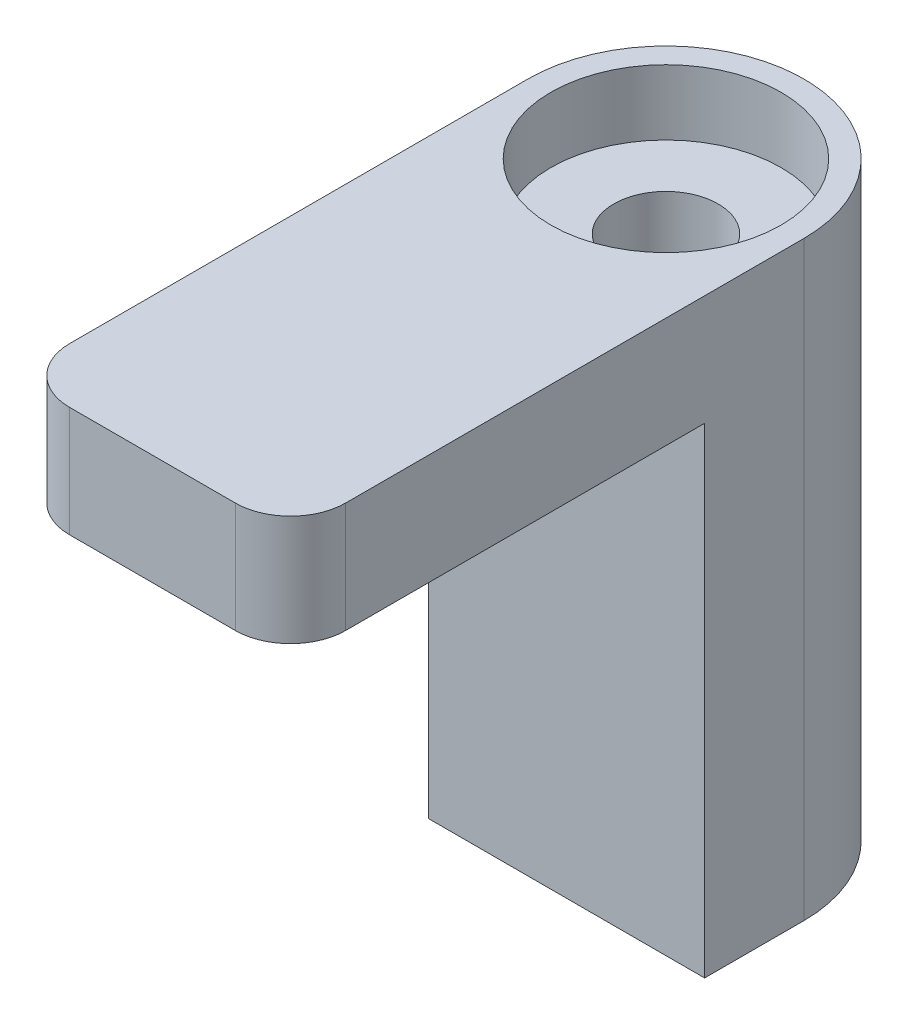
ISO-10303-21;
HEADER;
FILE_DESCRIPTION(('STEP AP214'),'2;1');
FILE_NAME('part.step','',(''),(''),'','','');
FILE_SCHEMA(('AUTOMOTIVE_DESIGN { 1 0 10303 214 1 1 1 1 }'));
ENDSEC;
DATA;
#1=APPLICATION_CONTEXT('core data for automotive mechanical design processes');
#2=APPLICATION_PROTOCOL_DEFINITION('international standard','automotive_design',2000,#1);
#3=PRODUCT_CONTEXT('',#1,'mechanical');
#4=PRODUCT('Part','Part','',(#3));
#5=PRODUCT_RELATED_PRODUCT_CATEGORY('part','',(#4));
#6=PRODUCT_DEFINITION_FORMATION('','',#4);
#7=PRODUCT_DEFINITION_CONTEXT('part definition',#1,'design');
#8=PRODUCT_DEFINITION('design','',#6,#7);
#9=PRODUCT_DEFINITION_SHAPE('','',#8);
#10=(LENGTH_UNIT() NAMED_UNIT(*) SI_UNIT(.MILLI.,.METRE.));
#11=(NAMED_UNIT(*) PLANE_ANGLE_UNIT() SI_UNIT($,.RADIAN.));
#12=(NAMED_UNIT(*) SI_UNIT($,.STERADIAN.) SOLID_ANGLE_UNIT());
#13=UNCERTAINTY_MEASURE_WITH_UNIT(LENGTH_MEASURE(1.E-05),#10,'distance_accuracy_value','');
#14=(GEOMETRIC_REPRESENTATION_CONTEXT(3) GLOBAL_UNCERTAINTY_ASSIGNED_CONTEXT((#13)) GLOBAL_UNIT_ASSIGNED_CONTEXT((#10,
#11,#12)) REPRESENTATION_CONTEXT('',''));
#15=CARTESIAN_POINT('',(0.,0.,0.));
#16=DIRECTION('',(0.,0.,1.));
#17=DIRECTION('',(1.,0.,0.));
#18=AXIS2_PLACEMENT_3D('',#15,#16,#17);
#19=CARTESIAN_POINT('',(6.35,22.098,-4.572));
#20=DIRECTION('',(-1.,0.,0.));
#21=DIRECTION('',(0.,0.,1.));
#22=AXIS2_PLACEMENT_3D('',#19,#20,#21);
#23=PLANE('',#22);
#24=DIRECTION('',(0.,0.,-1.));
#25=VECTOR('',#24,1.);
#26=CARTESIAN_POINT('',(6.35,27.178,0.));
#27=LINE('',#26,#25);
#28=CARTESIAN_POINT('',(6.35,27.178,16.51));
#29=VERTEX_POINT('',#28);
#30=CARTESIAN_POINT('',(6.35,27.178,-4.57200000000001));
#31=VERTEX_POINT('',#30);
#32=EDGE_CURVE('E103',#29,#31,#27,.T.);
#33=ORIENTED_EDGE('',*,*,#32,.F.);
#34=DIRECTION('',(0.,-1.,0.));
#35=VECTOR('',#34,1.);
#36=CARTESIAN_POINT('',(6.34999999999999,22.098,16.51));
#37=LINE('',#36,#35);
#38=CARTESIAN_POINT('',(6.34999999999999,22.098,16.51));
#39=VERTEX_POINT('',#38);
#40=EDGE_CURVE('E121',#29,#39,#37,.T.);
#41=ORIENTED_EDGE('',*,*,#40,.T.);
#42=DIRECTION('',(0.,0.,-1.));
#43=VECTOR('',#42,1.);
#44=CARTESIAN_POINT('',(6.35,22.098,0.));
#45=LINE('',#44,#43);
#46=CARTESIAN_POINT('',(6.35,22.098,0.));
#47=VERTEX_POINT('',#46);
#48=EDGE_CURVE('E133',#39,#47,#45,.T.);
#49=ORIENTED_EDGE('',*,*,#48,.T.);
#50=DIRECTION('',(0.,-1.,0.));
#51=VECTOR('',#50,1.);
#52=CARTESIAN_POINT('',(6.35,22.098,0.));
#53=LINE('',#52,#51);
#54=CARTESIAN_POINT('',(6.35,0.,0.));
#55=VERTEX_POINT('',#54);
#56=EDGE_CURVE('E142',#47,#55,#53,.T.);
#57=ORIENTED_EDGE('',*,*,#56,.T.);
#58=DIRECTION('',(0.,0.,-1.));
#59=VECTOR('',#58,1.);
#60=CARTESIAN_POINT('',(6.35,0.,-4.572));
#61=LINE('',#60,#59);
#62=CARTESIAN_POINT('',(6.35,0.,-4.572));
#63=VERTEX_POINT('',#62);
#64=EDGE_CURVE('E119',#55,#63,#61,.T.);
#65=ORIENTED_EDGE('',*,*,#64,.T.);
#66=DIRECTION('',(0.,-1.,0.));
#67=VECTOR('',#66,1.);
#68=CARTESIAN_POINT('',(6.35,22.098,-4.572));
#69=LINE('',#68,#67);
#70=EDGE_CURVE('E116',#31,#63,#69,.T.);
#71=ORIENTED_EDGE('',*,*,#70,.F.);
#72=EDGE_LOOP('',(#33,#41,#49,#57,#65,#71));
#73=FACE_BOUND('',#72,.T.);
#74=ADVANCED_FACE('F36',(#73),#23,.F.);
#75=CARTESIAN_POINT('',(0.,22.098,-4.572));
#76=DIRECTION('',(0.,-1.,0.));
#77=DIRECTION('',(0.,0.,-1.));
#78=AXIS2_PLACEMENT_3D('',#75,#76,#77);
#79=CYLINDRICAL_SURFACE('',#78,6.35);
#80=CARTESIAN_POINT('',(0.,0.,-4.572));
#81=DIRECTION('',(0.,1.,0.));
#82=DIRECTION('',(0.,0.,1.));
#83=AXIS2_PLACEMENT_3D('',#80,#81,#82);
#84=CIRCLE('',#83,6.35);
#85=CARTESIAN_POINT('',(-6.35,0.,-4.572));
#86=VERTEX_POINT('',#85);
#87=EDGE_CURVE('E145',#63,#86,#84,.T.);
#88=ORIENTED_EDGE('',*,*,#87,.T.);
#89=DIRECTION('',(0.,-1.,0.));
#90=VECTOR('',#89,1.);
#91=CARTESIAN_POINT('',(-6.35,22.098,-4.57199999999999));
#92=LINE('',#91,#90);
#93=CARTESIAN_POINT('',(-6.35,27.178,-4.572));
#94=VERTEX_POINT('',#93);
#95=EDGE_CURVE('E122',#94,#86,#92,.T.);
#96=ORIENTED_EDGE('',*,*,#95,.F.);
#97=CARTESIAN_POINT('',(0.,27.178,-4.572));
#98=DIRECTION('',(0.,1.,0.));
#99=DIRECTION('',(0.,0.,1.));
#100=AXIS2_PLACEMENT_3D('',#97,#98,#99);
#101=CIRCLE('',#100,6.35);
#102=EDGE_CURVE('E107',#31,#94,#101,.T.);
#103=ORIENTED_EDGE('',*,*,#102,.F.);
#104=ORIENTED_EDGE('',*,*,#70,.T.);
#105=EDGE_LOOP('',(#88,#96,#103,#104));
#106=FACE_BOUND('',#105,.T.);
#107=ADVANCED_FACE('F124',(#106),#79,.T.);
#108=CARTESIAN_POINT('',(-6.35,22.098,-4.57199999999999));
#109=DIRECTION('',(1.,0.,0.));
#110=DIRECTION('',(0.,0.,-1.));
#111=AXIS2_PLACEMENT_3D('',#108,#109,#110);
#112=PLANE('',#111);
#113=DIRECTION('',(0.,0.,1.));
#114=VECTOR('',#113,1.);
#115=CARTESIAN_POINT('',(-6.35,22.098,0.));
#116=LINE('',#115,#114);
#117=CARTESIAN_POINT('',(-6.35,22.098,0.));
#118=VERTEX_POINT('',#117);
#119=CARTESIAN_POINT('',(-6.34999999999999,22.098,16.51));
#120=VERTEX_POINT('',#119);
#121=EDGE_CURVE('E135',#118,#120,#116,.T.);
#122=ORIENTED_EDGE('',*,*,#121,.T.);
#123=DIRECTION('',(0.,-1.,0.));
#124=VECTOR('',#123,1.);
#125=CARTESIAN_POINT('',(-6.34999999999999,22.098,16.51));
#126=LINE('',#125,#124);
#127=CARTESIAN_POINT('',(-6.34999999999999,27.178,16.51));
#128=VERTEX_POINT('',#127);
#129=EDGE_CURVE('E11',#120,#128,#126,.F.);
#130=ORIENTED_EDGE('',*,*,#129,.T.);
#131=DIRECTION('',(0.,0.,1.));
#132=VECTOR('',#131,1.);
#133=CARTESIAN_POINT('',(-6.35,27.178,-4.572));
#134=LINE('',#133,#132);
#135=EDGE_CURVE('E126',#94,#128,#134,.T.);
#136=ORIENTED_EDGE('',*,*,#135,.F.);
#137=ORIENTED_EDGE('',*,*,#95,.T.);
#138=DIRECTION('',(0.,0.,1.));
#139=VECTOR('',#138,1.);
#140=CARTESIAN_POINT('',(-6.35,0.,-4.572));
#141=LINE('',#140,#139);
#142=CARTESIAN_POINT('',(-6.35,0.,0.));
#143=VERTEX_POINT('',#142);
#144=EDGE_CURVE('E147',#86,#143,#141,.T.);
#145=ORIENTED_EDGE('',*,*,#144,.T.);
#146=DIRECTION('',(0.,-1.,0.));
#147=VECTOR('',#146,1.);
#148=CARTESIAN_POINT('',(-6.35,22.098,0.));
#149=LINE('',#148,#147);
#150=EDGE_CURVE('E151',#118,#143,#149,.T.);
#151=ORIENTED_EDGE('',*,*,#150,.F.);
#152=EDGE_LOOP('',(#122,#130,#136,#137,#145,#151));
#153=FACE_BOUND('',#152,.T.);
#154=ADVANCED_FACE('F174',(#153),#112,.F.);
#155=CARTESIAN_POINT('',(-6.35,22.098,0.));
#156=DIRECTION('',(0.,0.,-1.));
#157=DIRECTION('',(-1.,0.,0.));
#158=AXIS2_PLACEMENT_3D('',#155,#156,#157);
#159=PLANE('',#158);
#160=DIRECTION('',(1.,0.,0.));
#161=VECTOR('',#160,1.);
#162=CARTESIAN_POINT('',(-6.35,0.,0.));
#163=LINE('',#162,#161);
#164=EDGE_CURVE('E143',#143,#55,#163,.T.);
#165=ORIENTED_EDGE('',*,*,#164,.T.);
#166=ORIENTED_EDGE('',*,*,#56,.F.);
#167=DIRECTION('',(1.,0.,0.));
#168=VECTOR('',#167,1.);
#169=CARTESIAN_POINT('',(-6.35,22.098,0.));
#170=LINE('',#169,#168);
#171=EDGE_CURVE('E139',#118,#47,#170,.T.);
#172=ORIENTED_EDGE('',*,*,#171,.F.);
#173=ORIENTED_EDGE('',*,*,#150,.T.);
#174=EDGE_LOOP('',(#165,#166,#172,#173));
#175=FACE_BOUND('',#174,.T.);
#176=ADVANCED_FACE('F180',(#175),#159,.F.);
#177=CARTESIAN_POINT('',(0.,0.,-4.572));
#178=DIRECTION('',(0.,1.,0.));
#179=DIRECTION('',(0.,0.,1.));
#180=AXIS2_PLACEMENT_3D('',#177,#178,#179);
#181=PLANE('',#180);
#182=CARTESIAN_POINT('',(0.,0.,-4.572));
#183=DIRECTION('',(0.,1.,0.));
#184=DIRECTION('',(0.,0.,1.));
#185=AXIS2_PLACEMENT_3D('',#182,#183,#184);
#186=CIRCLE('',#185,2.4);
#187=CARTESIAN_POINT('',(0.,0.,-2.172));
#188=VERTEX_POINT('',#187);
#189=EDGE_CURVE('E225',#188,#188,#186,.T.);
#190=ORIENTED_EDGE('',*,*,#189,.T.);
#191=EDGE_LOOP('',(#190));
#192=FACE_BOUND('',#191,.T.);
#193=ORIENTED_EDGE('',*,*,#64,.F.);
#194=ORIENTED_EDGE('',*,*,#164,.F.);
#195=ORIENTED_EDGE('',*,*,#144,.F.);
#196=ORIENTED_EDGE('',*,*,#87,.F.);
#197=EDGE_LOOP('',(#193,#194,#195,#196));
#198=FACE_BOUND('',#197,.T.);
#199=ADVANCED_FACE('F202',(#192,#198),#181,.F.);
#200=CARTESIAN_POINT('',(0.,22.098,-4.572));
#201=DIRECTION('',(0.,1.,0.));
#202=DIRECTION('',(0.,0.,1.));
#203=AXIS2_PLACEMENT_3D('',#200,#201,#202);
#204=PLANE('',#203);
#205=ORIENTED_EDGE('',*,*,#48,.F.);
#206=CARTESIAN_POINT('',(3.80999999999999,22.098,16.51));
#207=DIRECTION('',(0.,1.,0.));
#208=DIRECTION('',(0.,0.,1.));
#209=AXIS2_PLACEMENT_3D('',#206,#207,#208);
#210=CIRCLE('',#209,2.54);
#211=CARTESIAN_POINT('',(3.80999999999999,22.098,19.05));
#212=VERTEX_POINT('',#211);
#213=EDGE_CURVE('E158',#39,#212,#210,.F.);
#214=ORIENTED_EDGE('',*,*,#213,.T.);
#215=DIRECTION('',(1.,0.,0.));
#216=VECTOR('',#215,1.);
#217=CARTESIAN_POINT('',(-6.34999999999999,22.098,19.05));
#218=LINE('',#217,#216);
#219=CARTESIAN_POINT('',(-3.80999999999999,22.098,19.05));
#220=VERTEX_POINT('',#219);
#221=EDGE_CURVE('E112',#220,#212,#218,.T.);
#222=ORIENTED_EDGE('',*,*,#221,.F.);
#223=CARTESIAN_POINT('',(-3.80999999999999,22.098,16.51));
#224=DIRECTION('',(0.,1.,0.));
#225=DIRECTION('',(0.,0.,1.));
#226=AXIS2_PLACEMENT_3D('',#223,#224,#225);
#227=CIRCLE('',#226,2.54);
#228=EDGE_CURVE('E156',#220,#120,#227,.F.);
#229=ORIENTED_EDGE('',*,*,#228,.T.);
#230=ORIENTED_EDGE('',*,*,#121,.F.);
#231=ORIENTED_EDGE('',*,*,#171,.T.);
#232=EDGE_LOOP('',(#205,#214,#222,#229,#230,#231));
#233=FACE_BOUND('',#232,.T.);
#234=ADVANCED_FACE('F173',(#233),#204,.F.);
#235=CARTESIAN_POINT('',(-6.34999999999999,27.178,19.05));
#236=DIRECTION('',(0.,0.,-1.));
#237=DIRECTION('',(-1.,0.,0.));
#238=AXIS2_PLACEMENT_3D('',#235,#236,#237);
#239=PLANE('',#238);
#240=ORIENTED_EDGE('',*,*,#221,.T.);
#241=DIRECTION('',(0.,-1.,0.));
#242=VECTOR('',#241,1.);
#243=CARTESIAN_POINT('',(3.80999999999999,27.178,19.05));
#244=LINE('',#243,#242);
#245=CARTESIAN_POINT('',(3.80999999999999,27.178,19.05));
#246=VERTEX_POINT('',#245);
#247=EDGE_CURVE('E57',#212,#246,#244,.F.);
#248=ORIENTED_EDGE('',*,*,#247,.T.);
#249=DIRECTION('',(1.,0.,0.));
#250=VECTOR('',#249,1.);
#251=CARTESIAN_POINT('',(-6.34999999999999,27.178,19.05));
#252=LINE('',#251,#250);
#253=CARTESIAN_POINT('',(-3.80999999999999,27.178,19.05));
#254=VERTEX_POINT('',#253);
#255=EDGE_CURVE('E128',#254,#246,#252,.T.);
#256=ORIENTED_EDGE('',*,*,#255,.F.);
#257=DIRECTION('',(0.,-1.,0.));
#258=VECTOR('',#257,1.);
#259=CARTESIAN_POINT('',(-3.80999999999999,27.178,19.05));
#260=LINE('',#259,#258);
#261=EDGE_CURVE('E160',#254,#220,#260,.T.);
#262=ORIENTED_EDGE('',*,*,#261,.T.);
#263=EDGE_LOOP('',(#240,#248,#256,#262));
#264=FACE_BOUND('',#263,.T.);
#265=ADVANCED_FACE('F168',(#264),#239,.F.);
#266=CARTESIAN_POINT('',(0.,27.178,-4.572));
#267=DIRECTION('',(0.,1.,0.));
#268=DIRECTION('',(0.,0.,1.));
#269=AXIS2_PLACEMENT_3D('',#266,#267,#268);
#270=PLANE('',#269);
#271=CARTESIAN_POINT('',(0.,27.178,-4.572));
#272=DIRECTION('',(0.,1.,0.));
#273=DIRECTION('',(0.,0.,1.));
#274=AXIS2_PLACEMENT_3D('',#271,#272,#273);
#275=CIRCLE('',#274,5.295);
#276=CARTESIAN_POINT('',(0.,27.178,0.723000000000001));
#277=VERTEX_POINT('',#276);
#278=EDGE_CURVE('E230',#277,#277,#275,.T.);
#279=ORIENTED_EDGE('',*,*,#278,.F.);
#280=EDGE_LOOP('',(#279));
#281=FACE_BOUND('',#280,.T.);
#282=ORIENTED_EDGE('',*,*,#255,.T.);
#283=CARTESIAN_POINT('',(3.80999999999999,27.178,16.51));
#284=DIRECTION('',(0.,1.,0.));
#285=DIRECTION('',(0.,0.,1.));
#286=AXIS2_PLACEMENT_3D('',#283,#284,#285);
#287=CIRCLE('',#286,2.54);
#288=EDGE_CURVE('E44',#246,#29,#287,.T.);
#289=ORIENTED_EDGE('',*,*,#288,.T.);
#290=ORIENTED_EDGE('',*,*,#32,.T.);
#291=ORIENTED_EDGE('',*,*,#102,.T.);
#292=ORIENTED_EDGE('',*,*,#135,.T.);
#293=CARTESIAN_POINT('',(-3.80999999999999,27.178,16.51));
#294=DIRECTION('',(0.,1.,0.));
#295=DIRECTION('',(0.,0.,1.));
#296=AXIS2_PLACEMENT_3D('',#293,#294,#295);
#297=CIRCLE('',#296,2.54);
#298=EDGE_CURVE('E164',#128,#254,#297,.T.);
#299=ORIENTED_EDGE('',*,*,#298,.T.);
#300=EDGE_LOOP('',(#282,#289,#290,#291,#292,#299));
#301=FACE_BOUND('',#300,.T.);
#302=ADVANCED_FACE('F105',(#281,#301),#270,.T.);
#303=CARTESIAN_POINT('',(3.80999999999999,22.098,16.51));
#304=DIRECTION('',(0.,-1.,0.));
#305=DIRECTION('',(0.,0.,-1.));
#306=AXIS2_PLACEMENT_3D('',#303,#304,#305);
#307=CYLINDRICAL_SURFACE('',#306,2.54);
#308=ORIENTED_EDGE('',*,*,#288,.F.);
#309=ORIENTED_EDGE('',*,*,#247,.F.);
#310=ORIENTED_EDGE('',*,*,#213,.F.);
#311=ORIENTED_EDGE('',*,*,#40,.F.);
#312=EDGE_LOOP('',(#308,#309,#310,#311));
#313=FACE_BOUND('',#312,.T.);
#314=ADVANCED_FACE('F182',(#313),#307,.T.);
#315=CARTESIAN_POINT('',(-3.80999999999999,27.178,16.51));
#316=DIRECTION('',(0.,-1.,0.));
#317=DIRECTION('',(0.,0.,-1.));
#318=AXIS2_PLACEMENT_3D('',#315,#316,#317);
#319=CYLINDRICAL_SURFACE('',#318,2.54);
#320=ORIENTED_EDGE('',*,*,#298,.F.);
#321=ORIENTED_EDGE('',*,*,#129,.F.);
#322=ORIENTED_EDGE('',*,*,#228,.F.);
#323=ORIENTED_EDGE('',*,*,#261,.F.);
#324=EDGE_LOOP('',(#320,#321,#322,#323));
#325=FACE_BOUND('',#324,.T.);
#326=ADVANCED_FACE('F38',(#325),#319,.T.);
#327=CARTESIAN_POINT('',(2.25,24.178,-4.57199999999999));
#328=DIRECTION('',(0.,-1.,0.));
#329=DIRECTION('',(0.,0.,-1.));
#330=AXIS2_PLACEMENT_3D('',#327,#328,#329);
#331=PLANE('',#330);
#332=CARTESIAN_POINT('',(0.,24.178,-4.57199999999999));
#333=DIRECTION('',(0.,1.,0.));
#334=DIRECTION('',(0.,0.,1.));
#335=AXIS2_PLACEMENT_3D('',#332,#333,#334);
#336=CIRCLE('',#335,2.4);
#337=CARTESIAN_POINT('',(0.,24.178,-2.17199999999999));
#338=VERTEX_POINT('',#337);
#339=EDGE_CURVE('E228',#338,#338,#336,.T.);
#340=ORIENTED_EDGE('',*,*,#339,.F.);
#341=EDGE_LOOP('',(#340));
#342=FACE_BOUND('',#341,.T.);
#343=CARTESIAN_POINT('',(0.,24.178,-4.57199999999999));
#344=DIRECTION('',(0.,1.,0.));
#345=DIRECTION('',(0.,0.,1.));
#346=AXIS2_PLACEMENT_3D('',#343,#344,#345);
#347=CIRCLE('',#346,5.295);
#348=CARTESIAN_POINT('',(0.,24.178,0.723000000000007));
#349=VERTEX_POINT('',#348);
#350=EDGE_CURVE('E136',#349,#349,#347,.T.);
#351=ORIENTED_EDGE('',*,*,#350,.T.);
#352=EDGE_LOOP('',(#351));
#353=FACE_BOUND('',#352,.T.);
#354=ADVANCED_FACE('F188',(#342,#353),#331,.F.);
#355=CARTESIAN_POINT('',(0.,27.178,-4.572));
#356=DIRECTION('',(0.,1.,0.));
#357=DIRECTION('',(0.,0.,1.));
#358=AXIS2_PLACEMENT_3D('',#355,#356,#357);
#359=CYLINDRICAL_SURFACE('',#358,5.295);
#360=ORIENTED_EDGE('',*,*,#350,.F.);
#361=EDGE_LOOP('',(#360));
#362=FACE_BOUND('',#361,.T.);
#363=ORIENTED_EDGE('',*,*,#278,.T.);
#364=EDGE_LOOP('',(#363));
#365=FACE_BOUND('',#364,.T.);
#366=ADVANCED_FACE('F212',(#362,#365),#359,.F.);
#367=CARTESIAN_POINT('',(0.,24.178,-4.57199999999999));
#368=DIRECTION('',(0.,1.,0.));
#369=DIRECTION('',(0.,0.,1.));
#370=AXIS2_PLACEMENT_3D('',#367,#368,#369);
#371=CYLINDRICAL_SURFACE('',#370,2.4);
#372=ORIENTED_EDGE('',*,*,#189,.F.);
#373=EDGE_LOOP('',(#372));
#374=FACE_BOUND('',#373,.T.);
#375=ORIENTED_EDGE('',*,*,#339,.T.);
#376=EDGE_LOOP('',(#375));
#377=FACE_BOUND('',#376,.T.);
#378=ADVANCED_FACE('F216',(#374,#377),#371,.F.);
#379=CLOSED_SHELL('',(#74,#107,#154,#176,#199,#234,#265,#302,#314,#326,#354,#366,#378));
#380=MANIFOLD_SOLID_BREP('B2',#379);
#381=ADVANCED_BREP_SHAPE_REPRESENTATION('',(#18,#380),#14);
#382=SHAPE_DEFINITION_REPRESENTATION(#9,#381);
ENDSEC;
END-ISO-10303-21;
